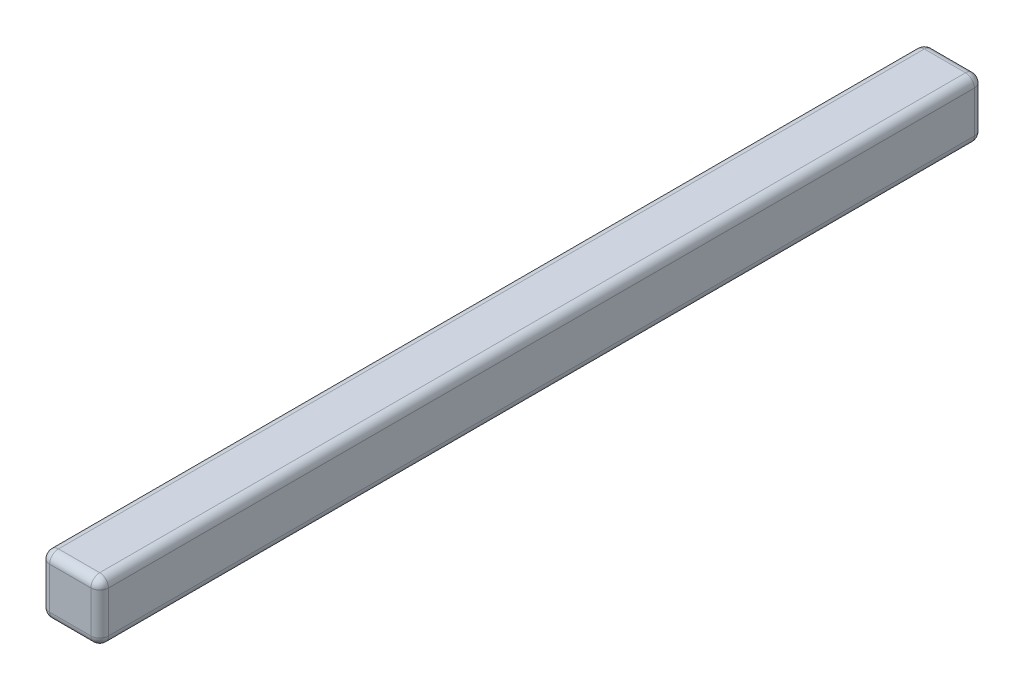
ISO-10303-21;
HEADER;
FILE_DESCRIPTION(('STEP AP214'),'2;1');
FILE_NAME('part.step','',(''),(''),'','','');
FILE_SCHEMA(('AUTOMOTIVE_DESIGN { 1 0 10303 214 1 1 1 1 }'));
ENDSEC;
DATA;
#1=APPLICATION_CONTEXT('core data for automotive mechanical design processes');
#2=APPLICATION_PROTOCOL_DEFINITION('international standard','automotive_design',2000,#1);
#3=PRODUCT_CONTEXT('',#1,'mechanical');
#4=PRODUCT('Part','Part','',(#3));
#5=PRODUCT_RELATED_PRODUCT_CATEGORY('part','',(#4));
#6=PRODUCT_DEFINITION_FORMATION('','',#4);
#7=PRODUCT_DEFINITION_CONTEXT('part definition',#1,'design');
#8=PRODUCT_DEFINITION('design','',#6,#7);
#9=PRODUCT_DEFINITION_SHAPE('','',#8);
#10=(LENGTH_UNIT() NAMED_UNIT(*) SI_UNIT(.MILLI.,.METRE.));
#11=(NAMED_UNIT(*) PLANE_ANGLE_UNIT() SI_UNIT($,.RADIAN.));
#12=(NAMED_UNIT(*) SI_UNIT($,.STERADIAN.) SOLID_ANGLE_UNIT());
#13=UNCERTAINTY_MEASURE_WITH_UNIT(LENGTH_MEASURE(1.E-05),#10,'distance_accuracy_value','');
#14=(GEOMETRIC_REPRESENTATION_CONTEXT(3) GLOBAL_UNCERTAINTY_ASSIGNED_CONTEXT((#13)) GLOBAL_UNIT_ASSIGNED_CONTEXT((#10,
#11,#12)) REPRESENTATION_CONTEXT('',''));
#15=CARTESIAN_POINT('',(0.,0.,0.));
#16=DIRECTION('',(0.,0.,1.));
#17=DIRECTION('',(1.,0.,0.));
#18=AXIS2_PLACEMENT_3D('',#15,#16,#17);
#19=CARTESIAN_POINT('',(40.,31.1250000000002,300.));
#20=DIRECTION('',(1.,0.,0.));
#21=DIRECTION('',(0.,0.,-1.));
#22=AXIS2_PLACEMENT_3D('',#19,#20,#21);
#23=PLANE('',#22);
#24=DIRECTION('',(0.,-1.,0.));
#25=VECTOR('',#24,1.);
#26=CARTESIAN_POINT('',(40.,31.1250000000002,3.));
#27=LINE('',#26,#25);
#28=CARTESIAN_POINT('',(40.,28.1250000000002,3.));
#29=VERTEX_POINT('',#28);
#30=CARTESIAN_POINT('',(40.,14.0249403218654,3.));
#31=VERTEX_POINT('',#30);
#32=EDGE_CURVE('E168',#29,#31,#27,.T.);
#33=ORIENTED_EDGE('',*,*,#32,.T.);
#34=DIRECTION('',(0.,0.,-1.));
#35=VECTOR('',#34,1.);
#36=CARTESIAN_POINT('',(40.,14.0249403218654,300.));
#37=LINE('',#36,#35);
#38=CARTESIAN_POINT('',(40.,14.0249403218654,297.));
#39=VERTEX_POINT('',#38);
#40=EDGE_CURVE('E173',#31,#39,#37,.F.);
#41=ORIENTED_EDGE('',*,*,#40,.T.);
#42=DIRECTION('',(0.,-1.,0.));
#43=VECTOR('',#42,1.);
#44=CARTESIAN_POINT('',(40.,31.1250000000002,297.));
#45=LINE('',#44,#43);
#46=CARTESIAN_POINT('',(40.,28.1250000000002,297.));
#47=VERTEX_POINT('',#46);
#48=EDGE_CURVE('E170',#39,#47,#45,.F.);
#49=ORIENTED_EDGE('',*,*,#48,.T.);
#50=DIRECTION('',(0.,0.,-1.));
#51=VECTOR('',#50,1.);
#52=CARTESIAN_POINT('',(40.,28.1250000000002,300.));
#53=LINE('',#52,#51);
#54=EDGE_CURVE('E166',#47,#29,#53,.T.);
#55=ORIENTED_EDGE('',*,*,#54,.T.);
#56=EDGE_LOOP('',(#33,#41,#49,#55));
#57=FACE_BOUND('',#56,.T.);
#58=ADVANCED_FACE('F36',(#57),#23,.F.);
#59=CARTESIAN_POINT('',(40.,11.0249403218654,300.));
#60=DIRECTION('',(0.,1.,0.));
#61=DIRECTION('',(-1.,0.,0.));
#62=AXIS2_PLACEMENT_3D('',#59,#60,#61);
#63=PLANE('',#62);
#64=DIRECTION('',(1.,0.,0.));
#65=VECTOR('',#64,1.);
#66=CARTESIAN_POINT('',(40.,11.0249403218654,297.));
#67=LINE('',#66,#65);
#68=CARTESIAN_POINT('',(57.,11.0249403218654,297.));
#69=VERTEX_POINT('',#68);
#70=CARTESIAN_POINT('',(43.,11.0249403218654,297.));
#71=VERTEX_POINT('',#70);
#72=EDGE_CURVE('E188',#69,#71,#67,.F.);
#73=ORIENTED_EDGE('',*,*,#72,.T.);
#74=DIRECTION('',(0.,0.,-1.));
#75=VECTOR('',#74,1.);
#76=CARTESIAN_POINT('',(43.,11.0249403218654,300.));
#77=LINE('',#76,#75);
#78=CARTESIAN_POINT('',(43.,11.0249403218654,3.));
#79=VERTEX_POINT('',#78);
#80=EDGE_CURVE('E190',#71,#79,#77,.T.);
#81=ORIENTED_EDGE('',*,*,#80,.T.);
#82=DIRECTION('',(1.,0.,0.));
#83=VECTOR('',#82,1.);
#84=CARTESIAN_POINT('',(40.,11.0249403218654,3.));
#85=LINE('',#84,#83);
#86=CARTESIAN_POINT('',(57.,11.0249403218654,3.));
#87=VERTEX_POINT('',#86);
#88=EDGE_CURVE('E186',#79,#87,#85,.T.);
#89=ORIENTED_EDGE('',*,*,#88,.T.);
#90=DIRECTION('',(0.,0.,-1.));
#91=VECTOR('',#90,1.);
#92=CARTESIAN_POINT('',(57.,11.0249403218654,300.));
#93=LINE('',#92,#91);
#94=EDGE_CURVE('E184',#87,#69,#93,.F.);
#95=ORIENTED_EDGE('',*,*,#94,.T.);
#96=EDGE_LOOP('',(#73,#81,#89,#95));
#97=FACE_BOUND('',#96,.T.);
#98=ADVANCED_FACE('F279',(#97),#63,.F.);
#99=CARTESIAN_POINT('',(60.,31.1250000000002,300.));
#100=DIRECTION('',(-1.,0.,0.));
#101=DIRECTION('',(0.,0.,1.));
#102=AXIS2_PLACEMENT_3D('',#99,#100,#101);
#103=PLANE('',#102);
#104=DIRECTION('',(0.,1.,0.));
#105=VECTOR('',#104,1.);
#106=CARTESIAN_POINT('',(60.,11.0249403218654,297.));
#107=LINE('',#106,#105);
#108=CARTESIAN_POINT('',(60.,28.1250000000002,297.));
#109=VERTEX_POINT('',#108);
#110=CARTESIAN_POINT('',(60.,14.0249403218654,297.));
#111=VERTEX_POINT('',#110);
#112=EDGE_CURVE('E141',#109,#111,#107,.F.);
#113=ORIENTED_EDGE('',*,*,#112,.T.);
#114=DIRECTION('',(0.,0.,-1.));
#115=VECTOR('',#114,1.);
#116=CARTESIAN_POINT('',(60.,14.0249403218654,300.));
#117=LINE('',#116,#115);
#118=CARTESIAN_POINT('',(60.,14.0249403218654,3.));
#119=VERTEX_POINT('',#118);
#120=EDGE_CURVE('E198',#111,#119,#117,.T.);
#121=ORIENTED_EDGE('',*,*,#120,.T.);
#122=DIRECTION('',(0.,1.,0.));
#123=VECTOR('',#122,1.);
#124=CARTESIAN_POINT('',(60.,31.1250000000002,3.));
#125=LINE('',#124,#123);
#126=CARTESIAN_POINT('',(60.,28.1250000000002,3.));
#127=VERTEX_POINT('',#126);
#128=EDGE_CURVE('E195',#119,#127,#125,.T.);
#129=ORIENTED_EDGE('',*,*,#128,.T.);
#130=DIRECTION('',(0.,0.,-1.));
#131=VECTOR('',#130,1.);
#132=CARTESIAN_POINT('',(60.,28.1250000000002,300.));
#133=LINE('',#132,#131);
#134=EDGE_CURVE('E193',#127,#109,#133,.F.);
#135=ORIENTED_EDGE('',*,*,#134,.T.);
#136=EDGE_LOOP('',(#113,#121,#129,#135));
#137=FACE_BOUND('',#136,.T.);
#138=ADVANCED_FACE('F266',(#137),#103,.F.);
#139=CARTESIAN_POINT('',(40.,31.1250000000002,300.));
#140=DIRECTION('',(0.,-1.,0.));
#141=DIRECTION('',(0.,0.,-1.));
#142=AXIS2_PLACEMENT_3D('',#139,#140,#141);
#143=PLANE('',#142);
#144=DIRECTION('',(-1.,0.,0.));
#145=VECTOR('',#144,1.);
#146=CARTESIAN_POINT('',(60.,31.1250000000002,297.));
#147=LINE('',#146,#145);
#148=CARTESIAN_POINT('',(43.,31.1250000000002,297.));
#149=VERTEX_POINT('',#148);
#150=CARTESIAN_POINT('',(57.,31.1250000000002,297.));
#151=VERTEX_POINT('',#150);
#152=EDGE_CURVE('E45',#149,#151,#147,.F.);
#153=ORIENTED_EDGE('',*,*,#152,.T.);
#154=DIRECTION('',(0.,0.,-1.));
#155=VECTOR('',#154,1.);
#156=CARTESIAN_POINT('',(57.,31.1250000000002,300.));
#157=LINE('',#156,#155);
#158=CARTESIAN_POINT('',(57.,31.1250000000002,3.));
#159=VERTEX_POINT('',#158);
#160=EDGE_CURVE('E11',#151,#159,#157,.T.);
#161=ORIENTED_EDGE('',*,*,#160,.T.);
#162=DIRECTION('',(-1.,0.,0.));
#163=VECTOR('',#162,1.);
#164=CARTESIAN_POINT('',(40.,31.1250000000002,3.));
#165=LINE('',#164,#163);
#166=CARTESIAN_POINT('',(43.,31.1250000000002,3.));
#167=VERTEX_POINT('',#166);
#168=EDGE_CURVE('E201',#159,#167,#165,.T.);
#169=ORIENTED_EDGE('',*,*,#168,.T.);
#170=DIRECTION('',(0.,0.,-1.));
#171=VECTOR('',#170,1.);
#172=CARTESIAN_POINT('',(43.,31.1250000000002,300.));
#173=LINE('',#172,#171);
#174=EDGE_CURVE('E56',#167,#149,#173,.F.);
#175=ORIENTED_EDGE('',*,*,#174,.T.);
#176=EDGE_LOOP('',(#153,#161,#169,#175));
#177=FACE_BOUND('',#176,.T.);
#178=ADVANCED_FACE('F312',(#177),#143,.F.);
#179=CARTESIAN_POINT('',(0.,0.,300.));
#180=DIRECTION('',(0.,0.,1.));
#181=DIRECTION('',(1.,0.,0.));
#182=AXIS2_PLACEMENT_3D('',#179,#180,#181);
#183=PLANE('',#182);
#184=DIRECTION('',(-1.,0.,0.));
#185=VECTOR('',#184,1.);
#186=CARTESIAN_POINT('',(40.,28.1250000000002,300.));
#187=LINE('',#186,#185);
#188=CARTESIAN_POINT('',(57.,28.1250000000002,300.));
#189=VERTEX_POINT('',#188);
#190=CARTESIAN_POINT('',(43.,28.1250000000002,300.));
#191=VERTEX_POINT('',#190);
#192=EDGE_CURVE('E128',#189,#191,#187,.T.);
#193=ORIENTED_EDGE('',*,*,#192,.T.);
#194=DIRECTION('',(0.,-1.,0.));
#195=VECTOR('',#194,1.);
#196=CARTESIAN_POINT('',(43.,11.0249403218654,300.));
#197=LINE('',#196,#195);
#198=CARTESIAN_POINT('',(43.,14.0249403218654,300.));
#199=VERTEX_POINT('',#198);
#200=EDGE_CURVE('E164',#191,#199,#197,.T.);
#201=ORIENTED_EDGE('',*,*,#200,.T.);
#202=DIRECTION('',(1.,0.,0.));
#203=VECTOR('',#202,1.);
#204=CARTESIAN_POINT('',(60.,14.0249403218654,300.));
#205=LINE('',#204,#203);
#206=CARTESIAN_POINT('',(57.,14.0249403218654,300.));
#207=VERTEX_POINT('',#206);
#208=EDGE_CURVE('E131',#199,#207,#205,.T.);
#209=ORIENTED_EDGE('',*,*,#208,.T.);
#210=DIRECTION('',(0.,1.,0.));
#211=VECTOR('',#210,1.);
#212=CARTESIAN_POINT('',(57.,31.1250000000002,300.));
#213=LINE('',#212,#211);
#214=EDGE_CURVE('E123',#207,#189,#213,.T.);
#215=ORIENTED_EDGE('',*,*,#214,.T.);
#216=EDGE_LOOP('',(#193,#201,#209,#215));
#217=FACE_BOUND('',#216,.T.);
#218=ADVANCED_FACE('F125',(#217),#183,.T.);
#219=CARTESIAN_POINT('',(0.,0.,0.));
#220=DIRECTION('',(0.,0.,1.));
#221=DIRECTION('',(1.,0.,0.));
#222=AXIS2_PLACEMENT_3D('',#219,#220,#221);
#223=PLANE('',#222);
#224=DIRECTION('',(1.,0.,0.));
#225=VECTOR('',#224,1.);
#226=CARTESIAN_POINT('',(0.,14.0249403218654,0.));
#227=LINE('',#226,#225);
#228=CARTESIAN_POINT('',(57.,14.0249403218654,0.));
#229=VERTEX_POINT('',#228);
#230=CARTESIAN_POINT('',(43.,14.0249403218654,0.));
#231=VERTEX_POINT('',#230);
#232=EDGE_CURVE('E179',#229,#231,#227,.F.);
#233=ORIENTED_EDGE('',*,*,#232,.T.);
#234=DIRECTION('',(0.,-1.,0.));
#235=VECTOR('',#234,1.);
#236=CARTESIAN_POINT('',(43.,0.,0.));
#237=LINE('',#236,#235);
#238=CARTESIAN_POINT('',(43.,28.1250000000002,0.));
#239=VERTEX_POINT('',#238);
#240=EDGE_CURVE('E181',#231,#239,#237,.F.);
#241=ORIENTED_EDGE('',*,*,#240,.T.);
#242=DIRECTION('',(-1.,0.,0.));
#243=VECTOR('',#242,1.);
#244=CARTESIAN_POINT('',(0.,28.1250000000002,0.));
#245=LINE('',#244,#243);
#246=CARTESIAN_POINT('',(57.,28.1250000000002,0.));
#247=VERTEX_POINT('',#246);
#248=EDGE_CURVE('E175',#239,#247,#245,.F.);
#249=ORIENTED_EDGE('',*,*,#248,.T.);
#250=DIRECTION('',(0.,1.,0.));
#251=VECTOR('',#250,1.);
#252=CARTESIAN_POINT('',(57.,0.,0.));
#253=LINE('',#252,#251);
#254=EDGE_CURVE('E177',#247,#229,#253,.F.);
#255=ORIENTED_EDGE('',*,*,#254,.T.);
#256=EDGE_LOOP('',(#233,#241,#249,#255));
#257=FACE_BOUND('',#256,.T.);
#258=ADVANCED_FACE('F295',(#257),#223,.F.);
#259=CARTESIAN_POINT('',(57.,31.1250000000002,3.));
#260=DIRECTION('',(0.,1.,0.));
#261=DIRECTION('',(0.,0.,1.));
#262=AXIS2_PLACEMENT_3D('',#259,#260,#261);
#263=CYLINDRICAL_SURFACE('',#262,3.);
#264=CARTESIAN_POINT('',(57.,28.1250000000002,3.));
#265=DIRECTION('',(0.,1.,0.));
#266=DIRECTION('',(0.,0.,1.));
#267=AXIS2_PLACEMENT_3D('',#264,#265,#266);
#268=CIRCLE('',#267,3.);
#269=EDGE_CURVE('E40',#127,#247,#268,.T.);
#270=ORIENTED_EDGE('',*,*,#269,.F.);
#271=ORIENTED_EDGE('',*,*,#128,.F.);
#272=CARTESIAN_POINT('',(57.,14.0249403218654,3.));
#273=DIRECTION('',(0.,-1.,0.));
#274=DIRECTION('',(1.,0.,0.));
#275=AXIS2_PLACEMENT_3D('',#272,#273,#274);
#276=CIRCLE('',#275,3.);
#277=EDGE_CURVE('E161',#229,#119,#276,.T.);
#278=ORIENTED_EDGE('',*,*,#277,.F.);
#279=ORIENTED_EDGE('',*,*,#254,.F.);
#280=EDGE_LOOP('',(#270,#271,#278,#279));
#281=FACE_BOUND('',#280,.T.);
#282=ADVANCED_FACE('F38',(#281),#263,.T.);
#283=CARTESIAN_POINT('',(57.,28.1250000000002,3.));
#284=DIRECTION('',(0.,0.,1.));
#285=DIRECTION('',(1.,0.,0.));
#286=AXIS2_PLACEMENT_3D('',#283,#284,#285);
#287=SPHERICAL_SURFACE('',#286,3.);
#288=CARTESIAN_POINT('',(57.,28.1250000000002,3.));
#289=DIRECTION('',(0.,0.,-1.));
#290=DIRECTION('',(-1.,0.,0.));
#291=AXIS2_PLACEMENT_3D('',#288,#289,#290);
#292=CIRCLE('',#291,3.);
#293=EDGE_CURVE('E246',#127,#159,#292,.F.);
#294=ORIENTED_EDGE('',*,*,#293,.F.);
#295=ORIENTED_EDGE('',*,*,#269,.T.);
#296=CARTESIAN_POINT('',(57.,28.1250000000002,3.));
#297=DIRECTION('',(1.,0.,0.));
#298=DIRECTION('',(0.,0.,-1.));
#299=AXIS2_PLACEMENT_3D('',#296,#297,#298);
#300=CIRCLE('',#299,3.);
#301=EDGE_CURVE('E249',#159,#247,#300,.F.);
#302=ORIENTED_EDGE('',*,*,#301,.F.);
#303=EDGE_LOOP('',(#294,#295,#302));
#304=FACE_BOUND('',#303,.T.);
#305=ADVANCED_FACE('F308',(#304),#287,.T.);
#306=CARTESIAN_POINT('',(57.,14.0249403218654,3.));
#307=DIRECTION('',(0.,0.,1.));
#308=DIRECTION('',(1.,0.,0.));
#309=AXIS2_PLACEMENT_3D('',#306,#307,#308);
#310=SPHERICAL_SURFACE('',#309,3.);
#311=CARTESIAN_POINT('',(57.,14.0249403218654,3.));
#312=DIRECTION('',(1.,0.,0.));
#313=DIRECTION('',(0.,0.,-1.));
#314=AXIS2_PLACEMENT_3D('',#311,#312,#313);
#315=CIRCLE('',#314,3.);
#316=EDGE_CURVE('E241',#229,#87,#315,.F.);
#317=ORIENTED_EDGE('',*,*,#316,.F.);
#318=ORIENTED_EDGE('',*,*,#277,.T.);
#319=CARTESIAN_POINT('',(57.,14.0249403218654,3.));
#320=DIRECTION('',(0.,0.,-1.));
#321=DIRECTION('',(-1.,0.,0.));
#322=AXIS2_PLACEMENT_3D('',#319,#320,#321);
#323=CIRCLE('',#322,3.);
#324=EDGE_CURVE('E244',#87,#119,#323,.F.);
#325=ORIENTED_EDGE('',*,*,#324,.F.);
#326=EDGE_LOOP('',(#317,#318,#325));
#327=FACE_BOUND('',#326,.T.);
#328=ADVANCED_FACE('F257',(#327),#310,.T.);
#329=CARTESIAN_POINT('',(40.,28.1250000000002,3.));
#330=DIRECTION('',(-1.,0.,0.));
#331=DIRECTION('',(0.,0.,1.));
#332=AXIS2_PLACEMENT_3D('',#329,#330,#331);
#333=CYLINDRICAL_SURFACE('',#332,3.);
#334=ORIENTED_EDGE('',*,*,#301,.T.);
#335=ORIENTED_EDGE('',*,*,#248,.F.);
#336=CARTESIAN_POINT('',(43.,28.1250000000002,3.));
#337=DIRECTION('',(-1.,0.,0.));
#338=DIRECTION('',(0.,0.,1.));
#339=AXIS2_PLACEMENT_3D('',#336,#337,#338);
#340=CIRCLE('',#339,3.);
#341=EDGE_CURVE('E236',#167,#239,#340,.T.);
#342=ORIENTED_EDGE('',*,*,#341,.F.);
#343=ORIENTED_EDGE('',*,*,#168,.F.);
#344=EDGE_LOOP('',(#334,#335,#342,#343));
#345=FACE_BOUND('',#344,.T.);
#346=ADVANCED_FACE('F305',(#345),#333,.T.);
#347=CARTESIAN_POINT('',(57.,28.1250000000002,300.));
#348=DIRECTION('',(0.,0.,-1.));
#349=DIRECTION('',(-1.,0.,0.));
#350=AXIS2_PLACEMENT_3D('',#347,#348,#349);
#351=CYLINDRICAL_SURFACE('',#350,3.);
#352=ORIENTED_EDGE('',*,*,#293,.T.);
#353=ORIENTED_EDGE('',*,*,#160,.F.);
#354=CARTESIAN_POINT('',(57.,28.1250000000002,297.));
#355=DIRECTION('',(0.,0.,1.));
#356=DIRECTION('',(1.,0.,0.));
#357=AXIS2_PLACEMENT_3D('',#354,#355,#356);
#358=CIRCLE('',#357,3.);
#359=EDGE_CURVE('E145',#109,#151,#358,.T.);
#360=ORIENTED_EDGE('',*,*,#359,.F.);
#361=ORIENTED_EDGE('',*,*,#134,.F.);
#362=EDGE_LOOP('',(#352,#353,#360,#361));
#363=FACE_BOUND('',#362,.T.);
#364=ADVANCED_FACE('F311',(#363),#351,.T.);
#365=CARTESIAN_POINT('',(57.,0.,297.));
#366=DIRECTION('',(0.,-1.,0.));
#367=DIRECTION('',(0.,0.,-1.));
#368=AXIS2_PLACEMENT_3D('',#365,#366,#367);
#369=CYLINDRICAL_SURFACE('',#368,3.);
#370=CARTESIAN_POINT('',(57.,14.0249403218654,297.));
#371=DIRECTION('',(0.,-1.,0.));
#372=DIRECTION('',(0.,0.,-1.));
#373=AXIS2_PLACEMENT_3D('',#370,#371,#372);
#374=CIRCLE('',#373,3.);
#375=EDGE_CURVE('E146',#111,#207,#374,.T.);
#376=ORIENTED_EDGE('',*,*,#375,.F.);
#377=ORIENTED_EDGE('',*,*,#112,.F.);
#378=CARTESIAN_POINT('',(57.,28.1250000000002,297.));
#379=DIRECTION('',(0.,1.,0.));
#380=DIRECTION('',(0.,0.,1.));
#381=AXIS2_PLACEMENT_3D('',#378,#379,#380);
#382=CIRCLE('',#381,3.);
#383=EDGE_CURVE('E138',#189,#109,#382,.T.);
#384=ORIENTED_EDGE('',*,*,#383,.F.);
#385=ORIENTED_EDGE('',*,*,#214,.F.);
#386=EDGE_LOOP('',(#376,#377,#384,#385));
#387=FACE_BOUND('',#386,.T.);
#388=ADVANCED_FACE('F140',(#387),#369,.T.);
#389=CARTESIAN_POINT('',(57.,14.0249403218654,300.));
#390=DIRECTION('',(0.,0.,-1.));
#391=DIRECTION('',(-1.,0.,0.));
#392=AXIS2_PLACEMENT_3D('',#389,#390,#391);
#393=CYLINDRICAL_SURFACE('',#392,3.);
#394=ORIENTED_EDGE('',*,*,#324,.T.);
#395=ORIENTED_EDGE('',*,*,#120,.F.);
#396=CARTESIAN_POINT('',(57.,14.0249403218654,297.));
#397=DIRECTION('',(0.,0.,1.));
#398=DIRECTION('',(1.,0.,0.));
#399=AXIS2_PLACEMENT_3D('',#396,#397,#398);
#400=CIRCLE('',#399,3.);
#401=EDGE_CURVE('E231',#69,#111,#400,.T.);
#402=ORIENTED_EDGE('',*,*,#401,.F.);
#403=ORIENTED_EDGE('',*,*,#94,.F.);
#404=EDGE_LOOP('',(#394,#395,#402,#403));
#405=FACE_BOUND('',#404,.T.);
#406=ADVANCED_FACE('F269',(#405),#393,.T.);
#407=CARTESIAN_POINT('',(40.,14.0249403218654,3.));
#408=DIRECTION('',(1.,0.,0.));
#409=DIRECTION('',(0.,1.,0.));
#410=AXIS2_PLACEMENT_3D('',#407,#408,#409);
#411=CYLINDRICAL_SURFACE('',#410,3.);
#412=ORIENTED_EDGE('',*,*,#316,.T.);
#413=ORIENTED_EDGE('',*,*,#88,.F.);
#414=CARTESIAN_POINT('',(43.,14.0249403218654,3.));
#415=DIRECTION('',(-1.,0.,0.));
#416=DIRECTION('',(0.,0.,1.));
#417=AXIS2_PLACEMENT_3D('',#414,#415,#416);
#418=CIRCLE('',#417,3.);
#419=EDGE_CURVE('E228',#231,#79,#418,.T.);
#420=ORIENTED_EDGE('',*,*,#419,.F.);
#421=ORIENTED_EDGE('',*,*,#232,.F.);
#422=EDGE_LOOP('',(#412,#413,#420,#421));
#423=FACE_BOUND('',#422,.T.);
#424=ADVANCED_FACE('F292',(#423),#411,.T.);
#425=CARTESIAN_POINT('',(43.,31.1250000000002,3.));
#426=DIRECTION('',(0.,-1.,0.));
#427=DIRECTION('',(0.,0.,-1.));
#428=AXIS2_PLACEMENT_3D('',#425,#426,#427);
#429=CYLINDRICAL_SURFACE('',#428,3.);
#430=CARTESIAN_POINT('',(43.,28.1250000000002,3.));
#431=DIRECTION('',(0.,1.,0.));
#432=DIRECTION('',(0.,0.,1.));
#433=AXIS2_PLACEMENT_3D('',#430,#431,#432);
#434=CIRCLE('',#433,3.);
#435=EDGE_CURVE('E238',#239,#29,#434,.T.);
#436=ORIENTED_EDGE('',*,*,#435,.F.);
#437=ORIENTED_EDGE('',*,*,#240,.F.);
#438=CARTESIAN_POINT('',(43.,14.0249403218654,3.));
#439=DIRECTION('',(0.,-1.,0.));
#440=DIRECTION('',(0.,0.,-1.));
#441=AXIS2_PLACEMENT_3D('',#438,#439,#440);
#442=CIRCLE('',#441,3.);
#443=EDGE_CURVE('E225',#31,#231,#442,.T.);
#444=ORIENTED_EDGE('',*,*,#443,.F.);
#445=ORIENTED_EDGE('',*,*,#32,.F.);
#446=EDGE_LOOP('',(#436,#437,#444,#445));
#447=FACE_BOUND('',#446,.T.);
#448=ADVANCED_FACE('F298',(#447),#429,.T.);
#449=CARTESIAN_POINT('',(43.,28.1250000000002,3.));
#450=DIRECTION('',(0.,0.,1.));
#451=DIRECTION('',(1.,0.,0.));
#452=AXIS2_PLACEMENT_3D('',#449,#450,#451);
#453=SPHERICAL_SURFACE('',#452,3.);
#454=ORIENTED_EDGE('',*,*,#341,.T.);
#455=ORIENTED_EDGE('',*,*,#435,.T.);
#456=CARTESIAN_POINT('',(43.,28.1250000000002,3.));
#457=DIRECTION('',(0.,0.,-1.));
#458=DIRECTION('',(-1.,0.,0.));
#459=AXIS2_PLACEMENT_3D('',#456,#457,#458);
#460=CIRCLE('',#459,3.);
#461=EDGE_CURVE('E152',#167,#29,#460,.F.);
#462=ORIENTED_EDGE('',*,*,#461,.F.);
#463=EDGE_LOOP('',(#454,#455,#462));
#464=FACE_BOUND('',#463,.T.);
#465=ADVANCED_FACE('F358',(#464),#453,.T.);
#466=CARTESIAN_POINT('',(57.,28.1250000000002,297.));
#467=DIRECTION('',(0.,0.,1.));
#468=DIRECTION('',(1.,0.,0.));
#469=AXIS2_PLACEMENT_3D('',#466,#467,#468);
#470=SPHERICAL_SURFACE('',#469,3.);
#471=ORIENTED_EDGE('',*,*,#383,.T.);
#472=ORIENTED_EDGE('',*,*,#359,.T.);
#473=CARTESIAN_POINT('',(57.,28.1250000000002,297.));
#474=DIRECTION('',(1.,0.,0.));
#475=DIRECTION('',(0.,0.,-1.));
#476=AXIS2_PLACEMENT_3D('',#473,#474,#475);
#477=CIRCLE('',#476,3.);
#478=EDGE_CURVE('E149',#189,#151,#477,.F.);
#479=ORIENTED_EDGE('',*,*,#478,.F.);
#480=EDGE_LOOP('',(#471,#472,#479));
#481=FACE_BOUND('',#480,.T.);
#482=ADVANCED_FACE('F150',(#481),#470,.T.);
#483=CARTESIAN_POINT('',(57.,14.0249403218654,297.));
#484=DIRECTION('',(0.,0.,1.));
#485=DIRECTION('',(1.,0.,0.));
#486=AXIS2_PLACEMENT_3D('',#483,#484,#485);
#487=SPHERICAL_SURFACE('',#486,3.);
#488=ORIENTED_EDGE('',*,*,#401,.T.);
#489=ORIENTED_EDGE('',*,*,#375,.T.);
#490=CARTESIAN_POINT('',(57.,14.0249403218654,297.));
#491=DIRECTION('',(1.,0.,0.));
#492=DIRECTION('',(0.,0.,-1.));
#493=AXIS2_PLACEMENT_3D('',#490,#491,#492);
#494=CIRCLE('',#493,3.);
#495=EDGE_CURVE('E153',#69,#207,#494,.F.);
#496=ORIENTED_EDGE('',*,*,#495,.F.);
#497=EDGE_LOOP('',(#488,#489,#496));
#498=FACE_BOUND('',#497,.T.);
#499=ADVANCED_FACE('F272',(#498),#487,.T.);
#500=CARTESIAN_POINT('',(43.,14.0249403218654,3.));
#501=DIRECTION('',(0.,0.,1.));
#502=DIRECTION('',(1.,0.,0.));
#503=AXIS2_PLACEMENT_3D('',#500,#501,#502);
#504=SPHERICAL_SURFACE('',#503,3.);
#505=ORIENTED_EDGE('',*,*,#443,.T.);
#506=ORIENTED_EDGE('',*,*,#419,.T.);
#507=CARTESIAN_POINT('',(43.,14.0249403218654,3.));
#508=DIRECTION('',(0.,0.,-1.));
#509=DIRECTION('',(-1.,0.,0.));
#510=AXIS2_PLACEMENT_3D('',#507,#508,#509);
#511=CIRCLE('',#510,3.);
#512=EDGE_CURVE('E219',#31,#79,#511,.F.);
#513=ORIENTED_EDGE('',*,*,#512,.F.);
#514=EDGE_LOOP('',(#505,#506,#513));
#515=FACE_BOUND('',#514,.T.);
#516=ADVANCED_FACE('F289',(#515),#504,.T.);
#517=CARTESIAN_POINT('',(43.,28.1250000000002,300.));
#518=DIRECTION('',(0.,0.,-1.));
#519=DIRECTION('',(-1.,0.,0.));
#520=AXIS2_PLACEMENT_3D('',#517,#518,#519);
#521=CYLINDRICAL_SURFACE('',#520,3.);
#522=ORIENTED_EDGE('',*,*,#461,.T.);
#523=ORIENTED_EDGE('',*,*,#54,.F.);
#524=CARTESIAN_POINT('',(43.,28.1250000000002,297.));
#525=DIRECTION('',(0.,0.,1.));
#526=DIRECTION('',(1.,0.,0.));
#527=AXIS2_PLACEMENT_3D('',#524,#525,#526);
#528=CIRCLE('',#527,3.);
#529=EDGE_CURVE('E216',#149,#47,#528,.T.);
#530=ORIENTED_EDGE('',*,*,#529,.F.);
#531=ORIENTED_EDGE('',*,*,#174,.F.);
#532=EDGE_LOOP('',(#522,#523,#530,#531));
#533=FACE_BOUND('',#532,.T.);
#534=ADVANCED_FACE('F348',(#533),#521,.T.);
#535=CARTESIAN_POINT('',(0.,28.1250000000002,297.));
#536=DIRECTION('',(1.,0.,0.));
#537=DIRECTION('',(0.,0.,-1.));
#538=AXIS2_PLACEMENT_3D('',#535,#536,#537);
#539=CYLINDRICAL_SURFACE('',#538,3.);
#540=ORIENTED_EDGE('',*,*,#478,.T.);
#541=ORIENTED_EDGE('',*,*,#152,.F.);
#542=CARTESIAN_POINT('',(43.,28.1250000000002,297.));
#543=DIRECTION('',(-1.,0.,0.));
#544=DIRECTION('',(0.,0.,1.));
#545=AXIS2_PLACEMENT_3D('',#542,#543,#544);
#546=CIRCLE('',#545,3.);
#547=EDGE_CURVE('E157',#191,#149,#546,.T.);
#548=ORIENTED_EDGE('',*,*,#547,.F.);
#549=ORIENTED_EDGE('',*,*,#192,.F.);
#550=EDGE_LOOP('',(#540,#541,#548,#549));
#551=FACE_BOUND('',#550,.T.);
#552=ADVANCED_FACE('F155',(#551),#539,.T.);
#553=CARTESIAN_POINT('',(0.,14.0249403218654,297.));
#554=DIRECTION('',(-1.,0.,0.));
#555=DIRECTION('',(0.,-1.,0.));
#556=AXIS2_PLACEMENT_3D('',#553,#554,#555);
#557=CYLINDRICAL_SURFACE('',#556,3.);
#558=ORIENTED_EDGE('',*,*,#495,.T.);
#559=ORIENTED_EDGE('',*,*,#208,.F.);
#560=CARTESIAN_POINT('',(43.,14.0249403218654,297.));
#561=DIRECTION('',(-1.,0.,0.));
#562=DIRECTION('',(0.,0.,1.));
#563=AXIS2_PLACEMENT_3D('',#560,#561,#562);
#564=CIRCLE('',#563,3.);
#565=EDGE_CURVE('E212',#71,#199,#564,.T.);
#566=ORIENTED_EDGE('',*,*,#565,.F.);
#567=ORIENTED_EDGE('',*,*,#72,.F.);
#568=EDGE_LOOP('',(#558,#559,#566,#567));
#569=FACE_BOUND('',#568,.T.);
#570=ADVANCED_FACE('F276',(#569),#557,.T.);
#571=CARTESIAN_POINT('',(43.,14.0249403218654,300.));
#572=DIRECTION('',(0.,0.,-1.));
#573=DIRECTION('',(-1.,0.,0.));
#574=AXIS2_PLACEMENT_3D('',#571,#572,#573);
#575=CYLINDRICAL_SURFACE('',#574,3.);
#576=ORIENTED_EDGE('',*,*,#512,.T.);
#577=ORIENTED_EDGE('',*,*,#80,.F.);
#578=CARTESIAN_POINT('',(43.,14.0249403218654,297.));
#579=DIRECTION('',(0.,0.,1.));
#580=DIRECTION('',(1.,0.,0.));
#581=AXIS2_PLACEMENT_3D('',#578,#579,#580);
#582=CIRCLE('',#581,3.);
#583=EDGE_CURVE('E209',#39,#71,#582,.T.);
#584=ORIENTED_EDGE('',*,*,#583,.F.);
#585=ORIENTED_EDGE('',*,*,#40,.F.);
#586=EDGE_LOOP('',(#576,#577,#584,#585));
#587=FACE_BOUND('',#586,.T.);
#588=ADVANCED_FACE('F282',(#587),#575,.T.);
#589=CARTESIAN_POINT('',(43.,28.1250000000002,297.));
#590=DIRECTION('',(0.,0.,1.));
#591=DIRECTION('',(1.,0.,0.));
#592=AXIS2_PLACEMENT_3D('',#589,#590,#591);
#593=SPHERICAL_SURFACE('',#592,3.);
#594=ORIENTED_EDGE('',*,*,#547,.T.);
#595=ORIENTED_EDGE('',*,*,#529,.T.);
#596=CARTESIAN_POINT('',(43.,28.1250000000002,297.));
#597=DIRECTION('',(0.,1.,0.));
#598=DIRECTION('',(0.,0.,1.));
#599=AXIS2_PLACEMENT_3D('',#596,#597,#598);
#600=CIRCLE('',#599,3.);
#601=EDGE_CURVE('E207',#191,#47,#600,.F.);
#602=ORIENTED_EDGE('',*,*,#601,.F.);
#603=EDGE_LOOP('',(#594,#595,#602));
#604=FACE_BOUND('',#603,.T.);
#605=ADVANCED_FACE('F337',(#604),#593,.T.);
#606=CARTESIAN_POINT('',(43.,14.0249403218654,297.));
#607=DIRECTION('',(0.,0.,1.));
#608=DIRECTION('',(1.,0.,0.));
#609=AXIS2_PLACEMENT_3D('',#606,#607,#608);
#610=SPHERICAL_SURFACE('',#609,3.);
#611=ORIENTED_EDGE('',*,*,#583,.T.);
#612=ORIENTED_EDGE('',*,*,#565,.T.);
#613=CARTESIAN_POINT('',(43.,14.0249403218654,297.));
#614=DIRECTION('',(0.,-1.,0.));
#615=DIRECTION('',(0.,0.,-1.));
#616=AXIS2_PLACEMENT_3D('',#613,#614,#615);
#617=CIRCLE('',#616,3.);
#618=EDGE_CURVE('E205',#39,#199,#617,.F.);
#619=ORIENTED_EDGE('',*,*,#618,.F.);
#620=EDGE_LOOP('',(#611,#612,#619));
#621=FACE_BOUND('',#620,.T.);
#622=ADVANCED_FACE('F333',(#621),#610,.T.);
#623=CARTESIAN_POINT('',(43.,0.,297.));
#624=DIRECTION('',(0.,1.,0.));
#625=DIRECTION('',(0.,0.,1.));
#626=AXIS2_PLACEMENT_3D('',#623,#624,#625);
#627=CYLINDRICAL_SURFACE('',#626,3.);
#628=ORIENTED_EDGE('',*,*,#601,.T.);
#629=ORIENTED_EDGE('',*,*,#48,.F.);
#630=ORIENTED_EDGE('',*,*,#618,.T.);
#631=ORIENTED_EDGE('',*,*,#200,.F.);
#632=EDGE_LOOP('',(#628,#629,#630,#631));
#633=FACE_BOUND('',#632,.T.);
#634=ADVANCED_FACE('F330',(#633),#627,.T.);
#635=CLOSED_SHELL('',(#58,#98,#138,#178,#218,#258,#282,#305,#328,#346,#364,#388,#406,#424,#448,
#465,#482,#499,#516,#534,#552,#570,#588,#605,#622,#634));
#636=MANIFOLD_SOLID_BREP('B2',#635);
#637=ADVANCED_BREP_SHAPE_REPRESENTATION('',(#18,#636),#14);
#638=SHAPE_DEFINITION_REPRESENTATION(#9,#637);
ENDSEC;
END-ISO-10303-21;
